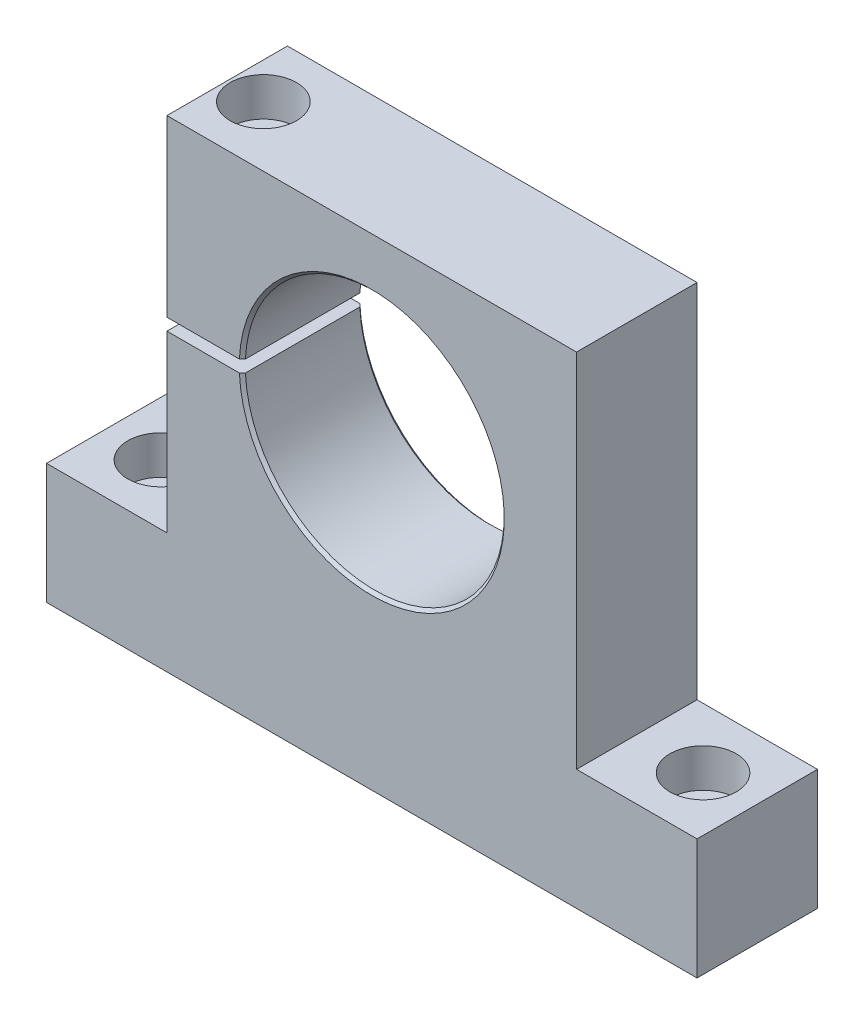
ISO-10303-21;
HEADER;
FILE_DESCRIPTION(('STEP AP214'),'2;1');
FILE_NAME('part.step','',(''),(''),'','','');
FILE_SCHEMA(('AUTOMOTIVE_DESIGN { 1 0 10303 214 1 1 1 1 }'));
ENDSEC;
DATA;
#1=APPLICATION_CONTEXT('core data for automotive mechanical design processes');
#2=APPLICATION_PROTOCOL_DEFINITION('international standard','automotive_design',2000,#1);
#3=PRODUCT_CONTEXT('',#1,'mechanical');
#4=PRODUCT('Part','Part','',(#3));
#5=PRODUCT_RELATED_PRODUCT_CATEGORY('part','',(#4));
#6=PRODUCT_DEFINITION_FORMATION('','',#4);
#7=PRODUCT_DEFINITION_CONTEXT('part definition',#1,'design');
#8=PRODUCT_DEFINITION('design','',#6,#7);
#9=PRODUCT_DEFINITION_SHAPE('','',#8);
#10=(LENGTH_UNIT() NAMED_UNIT(*) SI_UNIT(.MILLI.,.METRE.));
#11=(NAMED_UNIT(*) PLANE_ANGLE_UNIT() SI_UNIT($,.RADIAN.));
#12=(NAMED_UNIT(*) SI_UNIT($,.STERADIAN.) SOLID_ANGLE_UNIT());
#13=UNCERTAINTY_MEASURE_WITH_UNIT(LENGTH_MEASURE(1.E-05),#10,'distance_accuracy_value','');
#14=(GEOMETRIC_REPRESENTATION_CONTEXT(3) GLOBAL_UNCERTAINTY_ASSIGNED_CONTEXT((#13)) GLOBAL_UNIT_ASSIGNED_CONTEXT((#10,
#11,#12)) REPRESENTATION_CONTEXT('',''));
#15=CARTESIAN_POINT('',(0.,0.,0.));
#16=DIRECTION('',(0.,0.,1.));
#17=DIRECTION('',(1.,0.,0.));
#18=AXIS2_PLACEMENT_3D('',#15,#16,#17);
#19=CARTESIAN_POINT('',(20.,20.,20.));
#20=DIRECTION('',(1.,0.,0.));
#21=DIRECTION('',(0.,0.,-1.));
#22=AXIS2_PLACEMENT_3D('',#19,#20,#21);
#23=PLANE('',#22);
#24=DIRECTION('',(0.,-1.,0.));
#25=VECTOR('',#24,1.);
#26=CARTESIAN_POINT('',(20.,20.,0.));
#27=LINE('',#26,#25);
#28=CARTESIAN_POINT('',(20.,80.,0.));
#29=VERTEX_POINT('',#28);
#30=CARTESIAN_POINT('',(20.,51.,0.));
#31=VERTEX_POINT('',#30);
#32=EDGE_CURVE('E166',#29,#31,#27,.T.);
#33=ORIENTED_EDGE('',*,*,#32,.T.);
#34=DIRECTION('',(0.,0.,1.));
#35=VECTOR('',#34,1.);
#36=CARTESIAN_POINT('',(20.,51.,20.));
#37=LINE('',#36,#35);
#38=CARTESIAN_POINT('',(20.,51.,20.));
#39=VERTEX_POINT('',#38);
#40=EDGE_CURVE('E250',#31,#39,#37,.T.);
#41=ORIENTED_EDGE('',*,*,#40,.T.);
#42=DIRECTION('',(0.,-1.,0.));
#43=VECTOR('',#42,1.);
#44=CARTESIAN_POINT('',(20.,20.,20.));
#45=LINE('',#44,#43);
#46=CARTESIAN_POINT('',(20.,80.,20.));
#47=VERTEX_POINT('',#46);
#48=EDGE_CURVE('E308',#47,#39,#45,.T.);
#49=ORIENTED_EDGE('',*,*,#48,.F.);
#50=DIRECTION('',(0.,0.,-1.));
#51=VECTOR('',#50,1.);
#52=CARTESIAN_POINT('',(20.,80.,20.));
#53=LINE('',#52,#51);
#54=EDGE_CURVE('E182',#47,#29,#53,.T.);
#55=ORIENTED_EDGE('',*,*,#54,.T.);
#56=EDGE_LOOP('',(#33,#41,#49,#55));
#57=FACE_BOUND('',#56,.T.);
#58=ADVANCED_FACE('F33',(#57),#23,.F.);
#59=CARTESIAN_POINT('',(26.,80.,10.));
#60=DIRECTION('',(0.,1.,0.));
#61=DIRECTION('',(0.,0.,1.));
#62=AXIS2_PLACEMENT_3D('',#59,#60,#61);
#63=CYLINDRICAL_SURFACE('',#62,3.29999999999999);
#64=CARTESIAN_POINT('',(26.,51.,10.));
#65=DIRECTION('',(0.,1.,0.));
#66=DIRECTION('',(0.,0.,1.));
#67=AXIS2_PLACEMENT_3D('',#64,#65,#66);
#68=CIRCLE('',#67,3.29999999999999);
#69=CARTESIAN_POINT('',(26.,51.,13.3));
#70=VERTEX_POINT('',#69);
#71=EDGE_CURVE('E159',#70,#70,#68,.F.);
#72=ORIENTED_EDGE('',*,*,#71,.T.);
#73=EDGE_LOOP('',(#72));
#74=FACE_BOUND('',#73,.T.);
#75=CARTESIAN_POINT('',(26.,73.6,10.));
#76=DIRECTION('',(0.,1.,0.));
#77=DIRECTION('',(0.,0.,1.));
#78=AXIS2_PLACEMENT_3D('',#75,#76,#77);
#79=CIRCLE('',#78,3.29999999999999);
#80=CARTESIAN_POINT('',(26.,73.6,13.3));
#81=VERTEX_POINT('',#80);
#82=EDGE_CURVE('E265',#81,#81,#79,.T.);
#83=ORIENTED_EDGE('',*,*,#82,.T.);
#84=EDGE_LOOP('',(#83));
#85=FACE_BOUND('',#84,.T.);
#86=ADVANCED_FACE('F361',(#74,#85),#63,.F.);
#87=CARTESIAN_POINT('',(0.,0.,20.));
#88=DIRECTION('',(0.,0.,-1.));
#89=DIRECTION('',(-1.,0.,0.));
#90=AXIS2_PLACEMENT_3D('',#87,#88,#89);
#91=PLANE('',#90);
#92=DIRECTION('',(1.,0.,0.));
#93=VECTOR('',#92,1.);
#94=CARTESIAN_POINT('',(19.9047146945495,51.,20.));
#95=LINE('',#94,#93);
#96=CARTESIAN_POINT('',(32.0227390241641,51.,20.));
#97=VERTEX_POINT('',#96);
#98=EDGE_CURVE('E204',#39,#97,#95,.T.);
#99=ORIENTED_EDGE('',*,*,#98,.T.);
#100=CARTESIAN_POINT('',(54.,50.,20.));
#101=DIRECTION('',(0.,0.,-1.));
#102=DIRECTION('',(-1.,0.,0.));
#103=AXIS2_PLACEMENT_3D('',#100,#101,#102);
#104=CIRCLE('',#103,22.);
#105=CARTESIAN_POINT('',(32.0227390241641,49.,20.));
#106=VERTEX_POINT('',#105);
#107=EDGE_CURVE('E46',#97,#106,#104,.T.);
#108=ORIENTED_EDGE('',*,*,#107,.T.);
#109=DIRECTION('',(-1.,0.,0.));
#110=VECTOR('',#109,1.);
#111=CARTESIAN_POINT('',(19.9047146945495,49.,20.));
#112=LINE('',#111,#110);
#113=CARTESIAN_POINT('',(20.,49.,20.));
#114=VERTEX_POINT('',#113);
#115=EDGE_CURVE('E251',#106,#114,#112,.T.);
#116=ORIENTED_EDGE('',*,*,#115,.T.);
#117=CARTESIAN_POINT('',(20.,20.,20.));
#118=VERTEX_POINT('',#117);
#119=EDGE_CURVE('E158',#114,#118,#45,.T.);
#120=ORIENTED_EDGE('',*,*,#119,.T.);
#121=DIRECTION('',(-1.,0.,0.));
#122=VECTOR('',#121,1.);
#123=CARTESIAN_POINT('',(0.,20.,20.));
#124=LINE('',#123,#122);
#125=CARTESIAN_POINT('',(0.,20.,20.));
#126=VERTEX_POINT('',#125);
#127=EDGE_CURVE('E180',#118,#126,#124,.T.);
#128=ORIENTED_EDGE('',*,*,#127,.T.);
#129=DIRECTION('',(0.,-1.,0.));
#130=VECTOR('',#129,1.);
#131=CARTESIAN_POINT('',(0.,0.,20.));
#132=LINE('',#131,#130);
#133=CARTESIAN_POINT('',(0.,0.,20.));
#134=VERTEX_POINT('',#133);
#135=EDGE_CURVE('E175',#126,#134,#132,.T.);
#136=ORIENTED_EDGE('',*,*,#135,.T.);
#137=DIRECTION('',(1.,0.,0.));
#138=VECTOR('',#137,1.);
#139=CARTESIAN_POINT('',(0.,0.,20.));
#140=LINE('',#139,#138);
#141=CARTESIAN_POINT('',(108.,0.,20.));
#142=VERTEX_POINT('',#141);
#143=EDGE_CURVE('E298',#134,#142,#140,.T.);
#144=ORIENTED_EDGE('',*,*,#143,.T.);
#145=DIRECTION('',(0.,1.,0.));
#146=VECTOR('',#145,1.);
#147=CARTESIAN_POINT('',(108.,0.,20.));
#148=LINE('',#147,#146);
#149=CARTESIAN_POINT('',(108.,20.,20.));
#150=VERTEX_POINT('',#149);
#151=EDGE_CURVE('E300',#142,#150,#148,.T.);
#152=ORIENTED_EDGE('',*,*,#151,.T.);
#153=DIRECTION('',(-1.,0.,0.));
#154=VECTOR('',#153,1.);
#155=CARTESIAN_POINT('',(108.,20.,20.));
#156=LINE('',#155,#154);
#157=CARTESIAN_POINT('',(88.,20.,20.));
#158=VERTEX_POINT('',#157);
#159=EDGE_CURVE('E302',#150,#158,#156,.T.);
#160=ORIENTED_EDGE('',*,*,#159,.T.);
#161=DIRECTION('',(0.,1.,0.));
#162=VECTOR('',#161,1.);
#163=CARTESIAN_POINT('',(88.,20.,20.));
#164=LINE('',#163,#162);
#165=CARTESIAN_POINT('',(88.,80.,20.));
#166=VERTEX_POINT('',#165);
#167=EDGE_CURVE('E304',#158,#166,#164,.T.);
#168=ORIENTED_EDGE('',*,*,#167,.T.);
#169=DIRECTION('',(-1.,0.,0.));
#170=VECTOR('',#169,1.);
#171=CARTESIAN_POINT('',(20.,80.,20.));
#172=LINE('',#171,#170);
#173=EDGE_CURVE('E306',#166,#47,#172,.T.);
#174=ORIENTED_EDGE('',*,*,#173,.T.);
#175=ORIENTED_EDGE('',*,*,#48,.T.);
#176=EDGE_LOOP('',(#99,#108,#116,#120,#128,#136,#144,#152,#160,#168,#174,#175));
#177=FACE_BOUND('',#176,.T.);
#178=ADVANCED_FACE('F333',(#177),#91,.F.);
#179=CARTESIAN_POINT('',(0.,0.,0.));
#180=DIRECTION('',(0.,0.,-1.));
#181=DIRECTION('',(-1.,0.,0.));
#182=AXIS2_PLACEMENT_3D('',#179,#180,#181);
#183=PLANE('',#182);
#184=DIRECTION('',(-1.,0.,0.));
#185=VECTOR('',#184,1.);
#186=CARTESIAN_POINT('',(19.9047146945495,49.,0.));
#187=LINE('',#186,#185);
#188=CARTESIAN_POINT('',(32.0227390241641,49.,0.));
#189=VERTEX_POINT('',#188);
#190=CARTESIAN_POINT('',(20.,49.,0.));
#191=VERTEX_POINT('',#190);
#192=EDGE_CURVE('E140',#189,#191,#187,.T.);
#193=ORIENTED_EDGE('',*,*,#192,.F.);
#194=CARTESIAN_POINT('',(54.,50.,0.));
#195=DIRECTION('',(0.,0.,-1.));
#196=DIRECTION('',(-1.,0.,0.));
#197=AXIS2_PLACEMENT_3D('',#194,#195,#196);
#198=CIRCLE('',#197,22.);
#199=CARTESIAN_POINT('',(32.0227390241641,51.,0.));
#200=VERTEX_POINT('',#199);
#201=EDGE_CURVE('E200',#189,#200,#198,.F.);
#202=ORIENTED_EDGE('',*,*,#201,.T.);
#203=DIRECTION('',(1.,0.,0.));
#204=VECTOR('',#203,1.);
#205=CARTESIAN_POINT('',(19.9047146945495,51.,0.));
#206=LINE('',#205,#204);
#207=EDGE_CURVE('E151',#31,#200,#206,.T.);
#208=ORIENTED_EDGE('',*,*,#207,.F.);
#209=ORIENTED_EDGE('',*,*,#32,.F.);
#210=DIRECTION('',(-1.,0.,0.));
#211=VECTOR('',#210,1.);
#212=CARTESIAN_POINT('',(20.,80.,0.));
#213=LINE('',#212,#211);
#214=CARTESIAN_POINT('',(88.,80.,0.));
#215=VERTEX_POINT('',#214);
#216=EDGE_CURVE('E167',#215,#29,#213,.T.);
#217=ORIENTED_EDGE('',*,*,#216,.F.);
#218=DIRECTION('',(0.,1.,0.));
#219=VECTOR('',#218,1.);
#220=CARTESIAN_POINT('',(88.,20.,0.));
#221=LINE('',#220,#219);
#222=CARTESIAN_POINT('',(88.,20.,0.));
#223=VERTEX_POINT('',#222);
#224=EDGE_CURVE('E170',#223,#215,#221,.T.);
#225=ORIENTED_EDGE('',*,*,#224,.F.);
#226=DIRECTION('',(-1.,0.,0.));
#227=VECTOR('',#226,1.);
#228=CARTESIAN_POINT('',(108.,20.,0.));
#229=LINE('',#228,#227);
#230=CARTESIAN_POINT('',(108.,20.,0.));
#231=VERTEX_POINT('',#230);
#232=EDGE_CURVE('E318',#231,#223,#229,.T.);
#233=ORIENTED_EDGE('',*,*,#232,.F.);
#234=DIRECTION('',(0.,1.,0.));
#235=VECTOR('',#234,1.);
#236=CARTESIAN_POINT('',(108.,0.,0.));
#237=LINE('',#236,#235);
#238=CARTESIAN_POINT('',(108.,0.,0.));
#239=VERTEX_POINT('',#238);
#240=EDGE_CURVE('E316',#239,#231,#237,.T.);
#241=ORIENTED_EDGE('',*,*,#240,.F.);
#242=DIRECTION('',(1.,0.,0.));
#243=VECTOR('',#242,1.);
#244=CARTESIAN_POINT('',(0.,0.,0.));
#245=LINE('',#244,#243);
#246=CARTESIAN_POINT('',(0.,0.,0.));
#247=VERTEX_POINT('',#246);
#248=EDGE_CURVE('E314',#247,#239,#245,.T.);
#249=ORIENTED_EDGE('',*,*,#248,.F.);
#250=DIRECTION('',(0.,-1.,0.));
#251=VECTOR('',#250,1.);
#252=CARTESIAN_POINT('',(0.,0.,0.));
#253=LINE('',#252,#251);
#254=CARTESIAN_POINT('',(0.,20.,0.));
#255=VERTEX_POINT('',#254);
#256=EDGE_CURVE('E295',#255,#247,#253,.T.);
#257=ORIENTED_EDGE('',*,*,#256,.F.);
#258=DIRECTION('',(-1.,0.,0.));
#259=VECTOR('',#258,1.);
#260=CARTESIAN_POINT('',(0.,20.,0.));
#261=LINE('',#260,#259);
#262=CARTESIAN_POINT('',(20.,20.,0.));
#263=VERTEX_POINT('',#262);
#264=EDGE_CURVE('E165',#263,#255,#261,.T.);
#265=ORIENTED_EDGE('',*,*,#264,.F.);
#266=EDGE_CURVE('E156',#191,#263,#27,.T.);
#267=ORIENTED_EDGE('',*,*,#266,.F.);
#268=EDGE_LOOP('',(#193,#202,#208,#209,#217,#225,#233,#241,#249,#257,#265,#267));
#269=FACE_BOUND('',#268,.T.);
#270=ADVANCED_FACE('F163',(#269),#183,.T.);
#271=CARTESIAN_POINT('',(0.,0.,20.));
#272=DIRECTION('',(1.,0.,0.));
#273=DIRECTION('',(0.,0.,-1.));
#274=AXIS2_PLACEMENT_3D('',#271,#272,#273);
#275=PLANE('',#274);
#276=ORIENTED_EDGE('',*,*,#256,.T.);
#277=DIRECTION('',(0.,0.,-1.));
#278=VECTOR('',#277,1.);
#279=CARTESIAN_POINT('',(0.,0.,20.));
#280=LINE('',#279,#278);
#281=EDGE_CURVE('E197',#134,#247,#280,.T.);
#282=ORIENTED_EDGE('',*,*,#281,.F.);
#283=ORIENTED_EDGE('',*,*,#135,.F.);
#284=DIRECTION('',(0.,0.,-1.));
#285=VECTOR('',#284,1.);
#286=CARTESIAN_POINT('',(0.,20.,20.));
#287=LINE('',#286,#285);
#288=EDGE_CURVE('E176',#126,#255,#287,.T.);
#289=ORIENTED_EDGE('',*,*,#288,.T.);
#290=EDGE_LOOP('',(#276,#282,#283,#289));
#291=FACE_BOUND('',#290,.T.);
#292=ADVANCED_FACE('F348',(#291),#275,.F.);
#293=CARTESIAN_POINT('',(0.,0.,20.));
#294=DIRECTION('',(0.,1.,0.));
#295=DIRECTION('',(0.,0.,1.));
#296=AXIS2_PLACEMENT_3D('',#293,#294,#295);
#297=PLANE('',#296);
#298=CARTESIAN_POINT('',(8.99999999999999,0.,10.));
#299=DIRECTION('',(0.,1.,0.));
#300=DIRECTION('',(0.,0.,1.));
#301=AXIS2_PLACEMENT_3D('',#298,#299,#300);
#302=CIRCLE('',#301,3.3);
#303=CARTESIAN_POINT('',(8.99999999999999,0.,13.3));
#304=VERTEX_POINT('',#303);
#305=EDGE_CURVE('E280',#304,#304,#302,.T.);
#306=ORIENTED_EDGE('',*,*,#305,.T.);
#307=EDGE_LOOP('',(#306));
#308=FACE_BOUND('',#307,.T.);
#309=CARTESIAN_POINT('',(99.,0.,9.99999999999999));
#310=DIRECTION('',(0.,1.,0.));
#311=DIRECTION('',(0.,0.,1.));
#312=AXIS2_PLACEMENT_3D('',#309,#310,#311);
#313=CIRCLE('',#312,3.3);
#314=CARTESIAN_POINT('',(99.,0.,13.3));
#315=VERTEX_POINT('',#314);
#316=EDGE_CURVE('E292',#315,#315,#313,.T.);
#317=ORIENTED_EDGE('',*,*,#316,.T.);
#318=EDGE_LOOP('',(#317));
#319=FACE_BOUND('',#318,.T.);
#320=ORIENTED_EDGE('',*,*,#248,.T.);
#321=DIRECTION('',(0.,0.,-1.));
#322=VECTOR('',#321,1.);
#323=CARTESIAN_POINT('',(108.,0.,20.));
#324=LINE('',#323,#322);
#325=EDGE_CURVE('E194',#142,#239,#324,.T.);
#326=ORIENTED_EDGE('',*,*,#325,.F.);
#327=ORIENTED_EDGE('',*,*,#143,.F.);
#328=ORIENTED_EDGE('',*,*,#281,.T.);
#329=EDGE_LOOP('',(#320,#326,#327,#328));
#330=FACE_BOUND('',#329,.T.);
#331=ADVANCED_FACE('F344',(#308,#319,#330),#297,.F.);
#332=CARTESIAN_POINT('',(108.,0.,20.));
#333=DIRECTION('',(-1.,0.,0.));
#334=DIRECTION('',(0.,0.,1.));
#335=AXIS2_PLACEMENT_3D('',#332,#333,#334);
#336=PLANE('',#335);
#337=ORIENTED_EDGE('',*,*,#240,.T.);
#338=DIRECTION('',(0.,0.,-1.));
#339=VECTOR('',#338,1.);
#340=CARTESIAN_POINT('',(108.,20.,20.));
#341=LINE('',#340,#339);
#342=EDGE_CURVE('E191',#150,#231,#341,.T.);
#343=ORIENTED_EDGE('',*,*,#342,.F.);
#344=ORIENTED_EDGE('',*,*,#151,.F.);
#345=ORIENTED_EDGE('',*,*,#325,.T.);
#346=EDGE_LOOP('',(#337,#343,#344,#345));
#347=FACE_BOUND('',#346,.T.);
#348=ADVANCED_FACE('F341',(#347),#336,.F.);
#349=CARTESIAN_POINT('',(108.,20.,20.));
#350=DIRECTION('',(0.,-1.,0.));
#351=DIRECTION('',(0.,0.,-1.));
#352=AXIS2_PLACEMENT_3D('',#349,#350,#351);
#353=PLANE('',#352);
#354=CARTESIAN_POINT('',(99.,20.,9.99999999999999));
#355=DIRECTION('',(0.,1.,0.));
#356=DIRECTION('',(0.,0.,1.));
#357=AXIS2_PLACEMENT_3D('',#354,#355,#356);
#358=CIRCLE('',#357,5.49999999999999);
#359=CARTESIAN_POINT('',(99.,20.,15.5));
#360=VERTEX_POINT('',#359);
#361=EDGE_CURVE('E283',#360,#360,#358,.T.);
#362=ORIENTED_EDGE('',*,*,#361,.F.);
#363=EDGE_LOOP('',(#362));
#364=FACE_BOUND('',#363,.T.);
#365=ORIENTED_EDGE('',*,*,#232,.T.);
#366=DIRECTION('',(0.,0.,-1.));
#367=VECTOR('',#366,1.);
#368=CARTESIAN_POINT('',(88.,20.,20.));
#369=LINE('',#368,#367);
#370=EDGE_CURVE('E188',#158,#223,#369,.T.);
#371=ORIENTED_EDGE('',*,*,#370,.F.);
#372=ORIENTED_EDGE('',*,*,#159,.F.);
#373=ORIENTED_EDGE('',*,*,#342,.T.);
#374=EDGE_LOOP('',(#365,#371,#372,#373));
#375=FACE_BOUND('',#374,.T.);
#376=ADVANCED_FACE('F338',(#364,#375),#353,.F.);
#377=CARTESIAN_POINT('',(88.,20.,20.));
#378=DIRECTION('',(-1.,0.,0.));
#379=DIRECTION('',(0.,0.,1.));
#380=AXIS2_PLACEMENT_3D('',#377,#378,#379);
#381=PLANE('',#380);
#382=ORIENTED_EDGE('',*,*,#224,.T.);
#383=DIRECTION('',(0.,0.,-1.));
#384=VECTOR('',#383,1.);
#385=CARTESIAN_POINT('',(88.,80.,20.));
#386=LINE('',#385,#384);
#387=EDGE_CURVE('E185',#166,#215,#386,.T.);
#388=ORIENTED_EDGE('',*,*,#387,.F.);
#389=ORIENTED_EDGE('',*,*,#167,.F.);
#390=ORIENTED_EDGE('',*,*,#370,.T.);
#391=EDGE_LOOP('',(#382,#388,#389,#390));
#392=FACE_BOUND('',#391,.T.);
#393=ADVANCED_FACE('F322',(#392),#381,.F.);
#394=CARTESIAN_POINT('',(20.,80.,20.));
#395=DIRECTION('',(0.,-1.,0.));
#396=DIRECTION('',(0.,0.,-1.));
#397=AXIS2_PLACEMENT_3D('',#394,#395,#396);
#398=PLANE('',#397);
#399=CARTESIAN_POINT('',(26.,80.,10.));
#400=DIRECTION('',(0.,1.,0.));
#401=DIRECTION('',(0.,0.,1.));
#402=AXIS2_PLACEMENT_3D('',#399,#400,#401);
#403=CIRCLE('',#402,5.5);
#404=CARTESIAN_POINT('',(26.,80.,15.5));
#405=VERTEX_POINT('',#404);
#406=EDGE_CURVE('E259',#405,#405,#403,.T.);
#407=ORIENTED_EDGE('',*,*,#406,.F.);
#408=EDGE_LOOP('',(#407));
#409=FACE_BOUND('',#408,.T.);
#410=ORIENTED_EDGE('',*,*,#216,.T.);
#411=ORIENTED_EDGE('',*,*,#54,.F.);
#412=ORIENTED_EDGE('',*,*,#173,.F.);
#413=ORIENTED_EDGE('',*,*,#387,.T.);
#414=EDGE_LOOP('',(#410,#411,#412,#413));
#415=FACE_BOUND('',#414,.T.);
#416=ADVANCED_FACE('F329',(#409,#415),#398,.F.);
#417=ORIENTED_EDGE('',*,*,#119,.F.);
#418=DIRECTION('',(0.,0.,-1.));
#419=VECTOR('',#418,1.);
#420=CARTESIAN_POINT('',(20.,49.,20.));
#421=LINE('',#420,#419);
#422=EDGE_CURVE('E143',#114,#191,#421,.T.);
#423=ORIENTED_EDGE('',*,*,#422,.T.);
#424=ORIENTED_EDGE('',*,*,#266,.T.);
#425=DIRECTION('',(0.,0.,-1.));
#426=VECTOR('',#425,1.);
#427=CARTESIAN_POINT('',(20.,20.,20.));
#428=LINE('',#427,#426);
#429=EDGE_CURVE('E179',#118,#263,#428,.T.);
#430=ORIENTED_EDGE('',*,*,#429,.F.);
#431=EDGE_LOOP('',(#417,#423,#424,#430));
#432=FACE_BOUND('',#431,.T.);
#433=ADVANCED_FACE('F154',(#432),#23,.F.);
#434=CARTESIAN_POINT('',(0.,20.,20.));
#435=DIRECTION('',(0.,-1.,0.));
#436=DIRECTION('',(0.,0.,-1.));
#437=AXIS2_PLACEMENT_3D('',#434,#435,#436);
#438=PLANE('',#437);
#439=CARTESIAN_POINT('',(8.99999999999999,20.,10.));
#440=DIRECTION('',(0.,1.,0.));
#441=DIRECTION('',(0.,0.,1.));
#442=AXIS2_PLACEMENT_3D('',#439,#440,#441);
#443=CIRCLE('',#442,5.49999999999999);
#444=CARTESIAN_POINT('',(8.99999999999999,20.,15.5));
#445=VERTEX_POINT('',#444);
#446=EDGE_CURVE('E271',#445,#445,#443,.T.);
#447=ORIENTED_EDGE('',*,*,#446,.F.);
#448=EDGE_LOOP('',(#447));
#449=FACE_BOUND('',#448,.T.);
#450=ORIENTED_EDGE('',*,*,#264,.T.);
#451=ORIENTED_EDGE('',*,*,#288,.F.);
#452=ORIENTED_EDGE('',*,*,#127,.F.);
#453=ORIENTED_EDGE('',*,*,#429,.T.);
#454=EDGE_LOOP('',(#450,#451,#452,#453));
#455=FACE_BOUND('',#454,.T.);
#456=ADVANCED_FACE('F352',(#449,#455),#438,.F.);
#457=CARTESIAN_POINT('',(54.,50.,20.));
#458=DIRECTION('',(0.,0.,-1.));
#459=DIRECTION('',(-1.,0.,0.));
#460=AXIS2_PLACEMENT_3D('',#457,#458,#459);
#461=CYLINDRICAL_SURFACE('',#460,21.5);
#462=DIRECTION('',(0.,0.,-1.));
#463=VECTOR('',#462,1.);
#464=CARTESIAN_POINT('',(32.5232684050855,49.,20.));
#465=LINE('',#464,#463);
#466=CARTESIAN_POINT('',(32.5232684050855,49.,19.5));
#467=VERTEX_POINT('',#466);
#468=CARTESIAN_POINT('',(32.5232684050855,49.,0.500000000000015));
#469=VERTEX_POINT('',#468);
#470=EDGE_CURVE('E160',#467,#469,#465,.T.);
#471=ORIENTED_EDGE('',*,*,#470,.F.);
#472=CARTESIAN_POINT('',(54.,50.,19.5));
#473=DIRECTION('',(0.,0.,-1.));
#474=DIRECTION('',(-1.,0.,0.));
#475=AXIS2_PLACEMENT_3D('',#472,#473,#474);
#476=CIRCLE('',#475,21.5);
#477=CARTESIAN_POINT('',(32.5232684050855,51.,19.5));
#478=VERTEX_POINT('',#477);
#479=EDGE_CURVE('E233',#467,#478,#476,.F.);
#480=ORIENTED_EDGE('',*,*,#479,.T.);
#481=DIRECTION('',(0.,0.,-1.));
#482=VECTOR('',#481,1.);
#483=CARTESIAN_POINT('',(32.5232684050855,51.,20.));
#484=LINE('',#483,#482);
#485=CARTESIAN_POINT('',(32.5232684050855,51.,0.500000000000014));
#486=VERTEX_POINT('',#485);
#487=EDGE_CURVE('E207',#486,#478,#484,.F.);
#488=ORIENTED_EDGE('',*,*,#487,.F.);
#489=CARTESIAN_POINT('',(54.,50.,0.500000000000014));
#490=DIRECTION('',(0.,0.,-1.));
#491=DIRECTION('',(-1.,0.,0.));
#492=AXIS2_PLACEMENT_3D('',#489,#490,#491);
#493=CIRCLE('',#492,21.5);
#494=EDGE_CURVE('E215',#486,#469,#493,.T.);
#495=ORIENTED_EDGE('',*,*,#494,.T.);
#496=EDGE_LOOP('',(#471,#480,#488,#495));
#497=FACE_BOUND('',#496,.T.);
#498=ADVANCED_FACE('F243',(#497),#461,.F.);
#499=CARTESIAN_POINT('',(99.,20.,9.99999999999999));
#500=DIRECTION('',(0.,1.,0.));
#501=DIRECTION('',(0.,0.,1.));
#502=AXIS2_PLACEMENT_3D('',#499,#500,#501);
#503=CYLINDRICAL_SURFACE('',#502,3.3);
#504=ORIENTED_EDGE('',*,*,#316,.F.);
#505=EDGE_LOOP('',(#504));
#506=FACE_BOUND('',#505,.T.);
#507=CARTESIAN_POINT('',(99.,13.6,9.99999999999999));
#508=DIRECTION('',(0.,1.,0.));
#509=DIRECTION('',(0.,0.,1.));
#510=AXIS2_PLACEMENT_3D('',#507,#508,#509);
#511=CIRCLE('',#510,3.3);
#512=CARTESIAN_POINT('',(99.,13.6,13.3));
#513=VERTEX_POINT('',#512);
#514=EDGE_CURVE('E289',#513,#513,#511,.T.);
#515=ORIENTED_EDGE('',*,*,#514,.T.);
#516=EDGE_LOOP('',(#515));
#517=FACE_BOUND('',#516,.T.);
#518=ADVANCED_FACE('F402',(#506,#517),#503,.F.);
#519=CARTESIAN_POINT('',(102.3,13.6,9.99999999999999));
#520=DIRECTION('',(0.,-1.,0.));
#521=DIRECTION('',(0.,0.,-1.));
#522=AXIS2_PLACEMENT_3D('',#519,#520,#521);
#523=PLANE('',#522);
#524=ORIENTED_EDGE('',*,*,#514,.F.);
#525=EDGE_LOOP('',(#524));
#526=FACE_BOUND('',#525,.T.);
#527=CARTESIAN_POINT('',(99.,13.6,9.99999999999999));
#528=DIRECTION('',(0.,1.,0.));
#529=DIRECTION('',(0.,0.,1.));
#530=AXIS2_PLACEMENT_3D('',#527,#528,#529);
#531=CIRCLE('',#530,5.49999999999999);
#532=CARTESIAN_POINT('',(99.,13.6,15.5));
#533=VERTEX_POINT('',#532);
#534=EDGE_CURVE('E286',#533,#533,#531,.T.);
#535=ORIENTED_EDGE('',*,*,#534,.T.);
#536=EDGE_LOOP('',(#535));
#537=FACE_BOUND('',#536,.T.);
#538=ADVANCED_FACE('F405',(#526,#537),#523,.F.);
#539=CARTESIAN_POINT('',(99.,20.,9.99999999999999));
#540=DIRECTION('',(0.,1.,0.));
#541=DIRECTION('',(0.,0.,1.));
#542=AXIS2_PLACEMENT_3D('',#539,#540,#541);
#543=CYLINDRICAL_SURFACE('',#542,5.49999999999999);
#544=ORIENTED_EDGE('',*,*,#534,.F.);
#545=EDGE_LOOP('',(#544));
#546=FACE_BOUND('',#545,.T.);
#547=ORIENTED_EDGE('',*,*,#361,.T.);
#548=EDGE_LOOP('',(#547));
#549=FACE_BOUND('',#548,.T.);
#550=ADVANCED_FACE('F409',(#546,#549),#543,.F.);
#551=CARTESIAN_POINT('',(8.99999999999999,20.,10.));
#552=DIRECTION('',(0.,1.,0.));
#553=DIRECTION('',(0.,0.,1.));
#554=AXIS2_PLACEMENT_3D('',#551,#552,#553);
#555=CYLINDRICAL_SURFACE('',#554,3.3);
#556=ORIENTED_EDGE('',*,*,#305,.F.);
#557=EDGE_LOOP('',(#556));
#558=FACE_BOUND('',#557,.T.);
#559=CARTESIAN_POINT('',(8.99999999999999,13.6,10.));
#560=DIRECTION('',(0.,1.,0.));
#561=DIRECTION('',(0.,0.,1.));
#562=AXIS2_PLACEMENT_3D('',#559,#560,#561);
#563=CIRCLE('',#562,3.3);
#564=CARTESIAN_POINT('',(8.99999999999999,13.6,13.3));
#565=VERTEX_POINT('',#564);
#566=EDGE_CURVE('E277',#565,#565,#563,.T.);
#567=ORIENTED_EDGE('',*,*,#566,.T.);
#568=EDGE_LOOP('',(#567));
#569=FACE_BOUND('',#568,.T.);
#570=ADVANCED_FACE('F413',(#558,#569),#555,.F.);
#571=CARTESIAN_POINT('',(12.3,13.6,10.));
#572=DIRECTION('',(0.,-1.,0.));
#573=DIRECTION('',(0.,0.,-1.));
#574=AXIS2_PLACEMENT_3D('',#571,#572,#573);
#575=PLANE('',#574);
#576=ORIENTED_EDGE('',*,*,#566,.F.);
#577=EDGE_LOOP('',(#576));
#578=FACE_BOUND('',#577,.T.);
#579=CARTESIAN_POINT('',(8.99999999999999,13.6,10.));
#580=DIRECTION('',(0.,1.,0.));
#581=DIRECTION('',(0.,0.,1.));
#582=AXIS2_PLACEMENT_3D('',#579,#580,#581);
#583=CIRCLE('',#582,5.5);
#584=CARTESIAN_POINT('',(8.99999999999999,13.6,15.5));
#585=VERTEX_POINT('',#584);
#586=EDGE_CURVE('E274',#585,#585,#583,.T.);
#587=ORIENTED_EDGE('',*,*,#586,.T.);
#588=EDGE_LOOP('',(#587));
#589=FACE_BOUND('',#588,.T.);
#590=ADVANCED_FACE('F417',(#578,#589),#575,.F.);
#591=CARTESIAN_POINT('',(8.99999999999999,20.,10.));
#592=DIRECTION('',(0.,1.,0.));
#593=DIRECTION('',(0.,0.,1.));
#594=AXIS2_PLACEMENT_3D('',#591,#592,#593);
#595=CYLINDRICAL_SURFACE('',#594,5.5);
#596=ORIENTED_EDGE('',*,*,#586,.F.);
#597=EDGE_LOOP('',(#596));
#598=FACE_BOUND('',#597,.T.);
#599=ORIENTED_EDGE('',*,*,#446,.T.);
#600=EDGE_LOOP('',(#599));
#601=FACE_BOUND('',#600,.T.);
#602=ADVANCED_FACE('F421',(#598,#601),#595,.F.);
#603=CARTESIAN_POINT('',(29.3,73.6,10.));
#604=DIRECTION('',(0.,-1.,0.));
#605=DIRECTION('',(0.,0.,-1.));
#606=AXIS2_PLACEMENT_3D('',#603,#604,#605);
#607=PLANE('',#606);
#608=ORIENTED_EDGE('',*,*,#82,.F.);
#609=EDGE_LOOP('',(#608));
#610=FACE_BOUND('',#609,.T.);
#611=CARTESIAN_POINT('',(26.,73.6,10.));
#612=DIRECTION('',(0.,1.,0.));
#613=DIRECTION('',(0.,0.,1.));
#614=AXIS2_PLACEMENT_3D('',#611,#612,#613);
#615=CIRCLE('',#614,5.5);
#616=CARTESIAN_POINT('',(26.,73.6,15.5));
#617=VERTEX_POINT('',#616);
#618=EDGE_CURVE('E262',#617,#617,#615,.T.);
#619=ORIENTED_EDGE('',*,*,#618,.T.);
#620=EDGE_LOOP('',(#619));
#621=FACE_BOUND('',#620,.T.);
#622=ADVANCED_FACE('F425',(#610,#621),#607,.F.);
#623=CARTESIAN_POINT('',(26.,80.,10.));
#624=DIRECTION('',(0.,1.,0.));
#625=DIRECTION('',(0.,0.,1.));
#626=AXIS2_PLACEMENT_3D('',#623,#624,#625);
#627=CYLINDRICAL_SURFACE('',#626,5.5);
#628=ORIENTED_EDGE('',*,*,#618,.F.);
#629=EDGE_LOOP('',(#628));
#630=FACE_BOUND('',#629,.T.);
#631=ORIENTED_EDGE('',*,*,#406,.T.);
#632=EDGE_LOOP('',(#631));
#633=FACE_BOUND('',#632,.T.);
#634=ADVANCED_FACE('F433',(#630,#633),#627,.F.);
#635=CARTESIAN_POINT('',(19.9047146945495,49.,20.));
#636=DIRECTION('',(0.,-1.,0.));
#637=DIRECTION('',(0.,0.,-1.));
#638=AXIS2_PLACEMENT_3D('',#635,#636,#637);
#639=PLANE('',#638);
#640=CARTESIAN_POINT('',(26.,49.,10.));
#641=DIRECTION('',(0.,-1.,0.));
#642=DIRECTION('',(0.,0.,-1.));
#643=AXIS2_PLACEMENT_3D('',#640,#641,#642);
#644=CIRCLE('',#643,3.29999999999999);
#645=CARTESIAN_POINT('',(26.,49.,6.70000000000001));
#646=VERTEX_POINT('',#645);
#647=EDGE_CURVE('E201',#646,#646,#644,.F.);
#648=ORIENTED_EDGE('',*,*,#647,.F.);
#649=EDGE_LOOP('',(#648));
#650=FACE_BOUND('',#649,.T.);
#651=ORIENTED_EDGE('',*,*,#115,.F.);
#652=CARTESIAN_POINT('',(32.0227390241641,49.,20.));
#653=CARTESIAN_POINT('',(32.106159572975,49.,19.9166656509164));
#654=CARTESIAN_POINT('',(32.1895806291238,49.,19.8333318097079));
#655=CARTESIAN_POINT('',(32.3564237560976,49.,19.6666651430413));
#656=CARTESIAN_POINT('',(32.4398458269226,49.,19.583332317583));
#657=CARTESIAN_POINT('',(32.5232684050855,49.,19.5));
#658=B_SPLINE_CURVE_WITH_KNOTS('',3,(#652,#653,#654,#655,#656,#657),.UNSPECIFIED.,.F.,.F.,(4,2,
4),(0.,0.353740604533799,0.707481209067901),.UNSPECIFIED.);
#659=EDGE_CURVE('E11',#106,#467,#658,.T.);
#660=ORIENTED_EDGE('',*,*,#659,.T.);
#661=ORIENTED_EDGE('',*,*,#470,.T.);
#662=CARTESIAN_POINT('',(32.5232684050855,49.,0.500000000000014));
#663=CARTESIAN_POINT('',(32.4398458269226,49.,0.416667682416938));
#664=CARTESIAN_POINT('',(32.3564237560976,49.,0.333334856958713));
#665=CARTESIAN_POINT('',(32.1895806291239,49.,0.166668190292042));
#666=CARTESIAN_POINT('',(32.106159572975,49.,0.0833343490835943));
#667=CARTESIAN_POINT('',(32.0227390241641,49.,0.));
#668=B_SPLINE_CURVE_WITH_KNOTS('',3,(#662,#663,#664,#665,#666,#667),.UNSPECIFIED.,.F.,.F.,(4,2,
4),(0.,0.35374060453408,0.707481209067858),.UNSPECIFIED.);
#669=EDGE_CURVE('E146',#469,#189,#668,.T.);
#670=ORIENTED_EDGE('',*,*,#669,.T.);
#671=ORIENTED_EDGE('',*,*,#192,.T.);
#672=ORIENTED_EDGE('',*,*,#422,.F.);
#673=EDGE_LOOP('',(#651,#660,#661,#670,#671,#672));
#674=FACE_BOUND('',#673,.T.);
#675=ADVANCED_FACE('F142',(#650,#674),#639,.F.);
#676=CARTESIAN_POINT('',(19.9047146945495,51.,20.));
#677=DIRECTION('',(0.,1.,0.));
#678=DIRECTION('',(0.,0.,1.));
#679=AXIS2_PLACEMENT_3D('',#676,#677,#678);
#680=PLANE('',#679);
#681=ORIENTED_EDGE('',*,*,#71,.F.);
#682=EDGE_LOOP('',(#681));
#683=FACE_BOUND('',#682,.T.);
#684=ORIENTED_EDGE('',*,*,#487,.T.);
#685=CARTESIAN_POINT('',(32.5232684050855,51.,19.5));
#686=CARTESIAN_POINT('',(32.4398458269226,51.,19.583332317583));
#687=CARTESIAN_POINT('',(32.3564237560976,51.,19.6666651430413));
#688=CARTESIAN_POINT('',(32.1895806291238,51.,19.8333318097079));
#689=CARTESIAN_POINT('',(32.106159572975,51.,19.9166656509164));
#690=CARTESIAN_POINT('',(32.0227390241641,51.,20.));
#691=B_SPLINE_CURVE_WITH_KNOTS('',3,(#685,#686,#687,#688,#689,#690),.UNSPECIFIED.,.F.,.F.,(4,2,
4),(0.,0.353740604534103,0.707481209067901),.UNSPECIFIED.);
#692=EDGE_CURVE('E60',#478,#97,#691,.T.);
#693=ORIENTED_EDGE('',*,*,#692,.T.);
#694=ORIENTED_EDGE('',*,*,#98,.F.);
#695=ORIENTED_EDGE('',*,*,#40,.F.);
#696=ORIENTED_EDGE('',*,*,#207,.T.);
#697=CARTESIAN_POINT('',(32.0227390241641,51.,0.));
#698=CARTESIAN_POINT('',(32.106159572975,51.,0.0833343490835952));
#699=CARTESIAN_POINT('',(32.1895806291239,51.,0.166668190292043));
#700=CARTESIAN_POINT('',(32.3564237560976,51.,0.333334856958714));
#701=CARTESIAN_POINT('',(32.4398458269226,51.,0.416667682416938));
#702=CARTESIAN_POINT('',(32.5232684050855,51.,0.500000000000014));
#703=B_SPLINE_CURVE_WITH_KNOTS('',3,(#697,#698,#699,#700,#701,#702),.UNSPECIFIED.,.F.,.F.,(4,2,
4),(0.,0.353740604533773,0.707481209067852),.UNSPECIFIED.);
#704=EDGE_CURVE('E209',#200,#486,#703,.T.);
#705=ORIENTED_EDGE('',*,*,#704,.T.);
#706=EDGE_LOOP('',(#684,#693,#694,#695,#696,#705));
#707=FACE_BOUND('',#706,.T.);
#708=ADVANCED_FACE('F220',(#683,#707),#680,.F.);
#709=CARTESIAN_POINT('',(26.,30.,10.));
#710=DIRECTION('',(0.,1.,0.));
#711=DIRECTION('',(0.,0.,1.));
#712=AXIS2_PLACEMENT_3D('',#709,#710,#711);
#713=CONICAL_SURFACE('',#712,3.29999999999999,1.02974425867665);
#714=CARTESIAN_POINT('',(26.,28.017159957209,10.));
#715=VERTEX_POINT('',#714);
#716=VERTEX_LOOP('',#715);
#717=FACE_BOUND('',#716,.T.);
#718=CARTESIAN_POINT('',(26.,30.,10.));
#719=DIRECTION('',(0.,1.,0.));
#720=DIRECTION('',(0.,0.,1.));
#721=AXIS2_PLACEMENT_3D('',#718,#719,#720);
#722=CIRCLE('',#721,3.29999999999999);
#723=CARTESIAN_POINT('',(26.,30.,13.3));
#724=VERTEX_POINT('',#723);
#725=EDGE_CURVE('E268',#724,#724,#722,.T.);
#726=ORIENTED_EDGE('',*,*,#725,.T.);
#727=EDGE_LOOP('',(#726));
#728=FACE_BOUND('',#727,.T.);
#729=ADVANCED_FACE('F223',(#717,#728),#713,.F.);
#730=ORIENTED_EDGE('',*,*,#647,.T.);
#731=EDGE_LOOP('',(#730));
#732=FACE_BOUND('',#731,.T.);
#733=ORIENTED_EDGE('',*,*,#725,.F.);
#734=EDGE_LOOP('',(#733));
#735=FACE_BOUND('',#734,.T.);
#736=ADVANCED_FACE('F359',(#732,#735),#63,.F.);
#737=CARTESIAN_POINT('',(54.,50.,0.));
#738=DIRECTION('',(0.,0.,-1.));
#739=DIRECTION('',(-1.,0.,0.));
#740=AXIS2_PLACEMENT_3D('',#737,#738,#739);
#741=CONICAL_SURFACE('',#740,22.,0.785398163397441);
#742=ORIENTED_EDGE('',*,*,#669,.F.);
#743=ORIENTED_EDGE('',*,*,#494,.F.);
#744=ORIENTED_EDGE('',*,*,#704,.F.);
#745=ORIENTED_EDGE('',*,*,#201,.F.);
#746=EDGE_LOOP('',(#742,#743,#744,#745));
#747=FACE_BOUND('',#746,.T.);
#748=ADVANCED_FACE('F217',(#747),#741,.F.);
#749=CARTESIAN_POINT('',(54.,50.,19.5));
#750=DIRECTION('',(0.,0.,1.));
#751=DIRECTION('',(1.,0.,0.));
#752=AXIS2_PLACEMENT_3D('',#749,#750,#751);
#753=CONICAL_SURFACE('',#752,21.5,0.785398163397434);
#754=ORIENTED_EDGE('',*,*,#659,.F.);
#755=ORIENTED_EDGE('',*,*,#107,.F.);
#756=ORIENTED_EDGE('',*,*,#692,.F.);
#757=ORIENTED_EDGE('',*,*,#479,.F.);
#758=EDGE_LOOP('',(#754,#755,#756,#757));
#759=FACE_BOUND('',#758,.T.);
#760=ADVANCED_FACE('F35',(#759),#753,.F.);
#761=CLOSED_SHELL('',(#58,#86,#178,#270,#292,#331,#348,#376,#393,#416,#433,#456,#498,#518,#538,
#550,#570,#590,#602,#622,#634,#675,#708,#729,#736,#748,#760));
#762=MANIFOLD_SOLID_BREP('B2',#761);
#763=ADVANCED_BREP_SHAPE_REPRESENTATION('',(#18,#762),#14);
#764=SHAPE_DEFINITION_REPRESENTATION(#9,#763);
ENDSEC;
END-ISO-10303-21;
